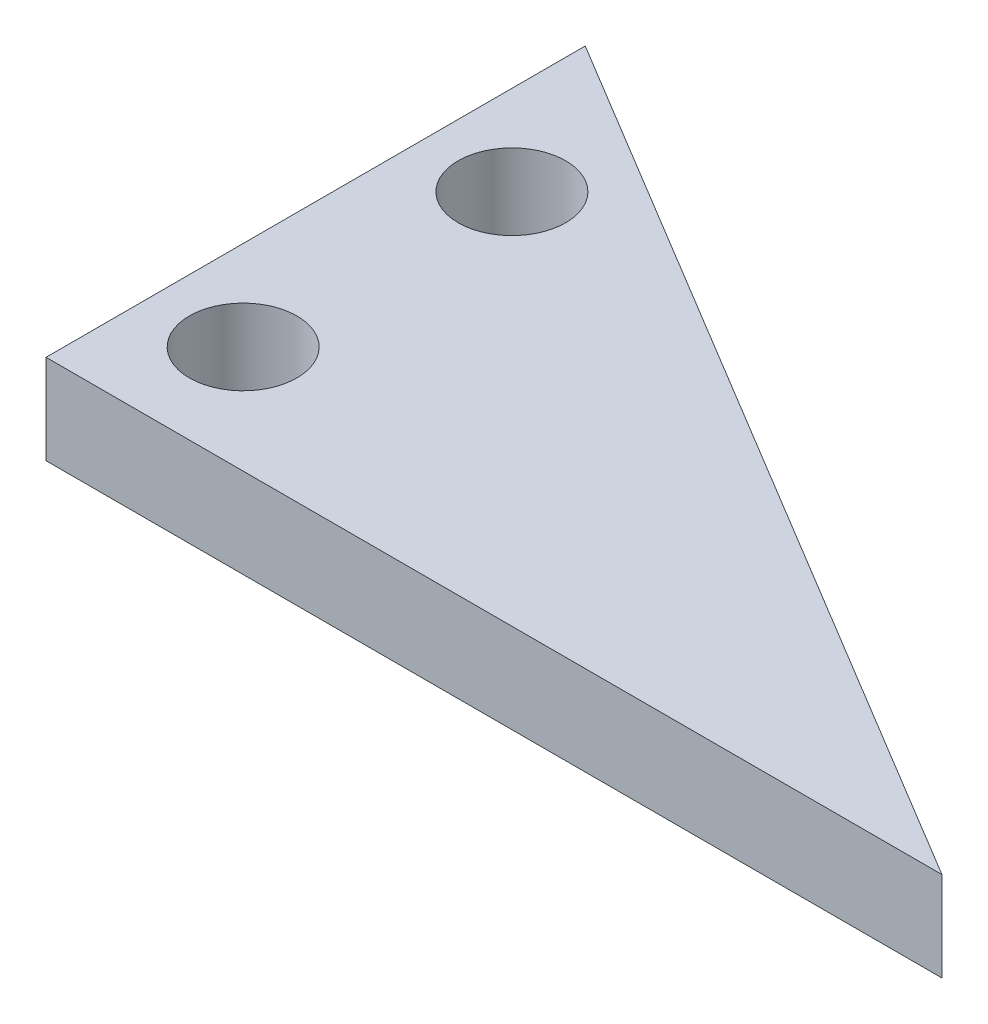
ISO-10303-21;
HEADER;
FILE_DESCRIPTION(('STEP AP214'),'2;1');
FILE_NAME('part.step','',(''),(''),'','','');
FILE_SCHEMA(('AUTOMOTIVE_DESIGN { 1 0 10303 214 1 1 1 1 }'));
ENDSEC;
DATA;
#1=APPLICATION_CONTEXT('core data for automotive mechanical design processes');
#2=APPLICATION_PROTOCOL_DEFINITION('international standard','automotive_design',2000,#1);
#3=PRODUCT_CONTEXT('',#1,'mechanical');
#4=PRODUCT('Part','Part','',(#3));
#5=PRODUCT_RELATED_PRODUCT_CATEGORY('part','',(#4));
#6=PRODUCT_DEFINITION_FORMATION('','',#4);
#7=PRODUCT_DEFINITION_CONTEXT('part definition',#1,'design');
#8=PRODUCT_DEFINITION('design','',#6,#7);
#9=PRODUCT_DEFINITION_SHAPE('','',#8);
#10=(LENGTH_UNIT() NAMED_UNIT(*) SI_UNIT(.MILLI.,.METRE.));
#11=(NAMED_UNIT(*) PLANE_ANGLE_UNIT() SI_UNIT($,.RADIAN.));
#12=(NAMED_UNIT(*) SI_UNIT($,.STERADIAN.) SOLID_ANGLE_UNIT());
#13=UNCERTAINTY_MEASURE_WITH_UNIT(LENGTH_MEASURE(1.E-05),#10,'distance_accuracy_value','');
#14=(GEOMETRIC_REPRESENTATION_CONTEXT(3) GLOBAL_UNCERTAINTY_ASSIGNED_CONTEXT((#13)) GLOBAL_UNIT_ASSIGNED_CONTEXT((#10,
#11,#12)) REPRESENTATION_CONTEXT('',''));
#15=CARTESIAN_POINT('',(0.,0.,0.));
#16=DIRECTION('',(0.,0.,1.));
#17=DIRECTION('',(1.,0.,0.));
#18=AXIS2_PLACEMENT_3D('',#15,#16,#17);
#19=CARTESIAN_POINT('',(0.,2.54,0.));
#20=DIRECTION('',(0.,-1.,0.));
#21=DIRECTION('',(0.,0.,-1.));
#22=AXIS2_PLACEMENT_3D('',#19,#20,#21);
#23=PLANE('',#22);
#24=DIRECTION('',(0.,0.,1.));
#25=VECTOR('',#24,1.);
#26=CARTESIAN_POINT('',(0.,2.54,0.));
#27=LINE('',#26,#25);
#28=CARTESIAN_POINT('',(0.,2.54,-15.2859179784456));
#29=VERTEX_POINT('',#28);
#30=CARTESIAN_POINT('',(0.,2.54,0.));
#31=VERTEX_POINT('',#30);
#32=EDGE_CURVE('E78',#29,#31,#27,.T.);
#33=ORIENTED_EDGE('',*,*,#32,.T.);
#34=DIRECTION('',(1.,0.,0.));
#35=VECTOR('',#34,1.);
#36=CARTESIAN_POINT('',(0.,2.54,0.));
#37=LINE('',#36,#35);
#38=CARTESIAN_POINT('',(25.4,2.54,0.));
#39=VERTEX_POINT('',#38);
#40=EDGE_CURVE('E77',#31,#39,#37,.T.);
#41=ORIENTED_EDGE('',*,*,#40,.T.);
#42=DIRECTION('',(-0.85680881602922,0.,-0.515634223820148));
#43=VECTOR('',#42,1.);
#44=CARTESIAN_POINT('',(0.,2.54,-15.2859179784456));
#45=LINE('',#44,#43);
#46=EDGE_CURVE('E57',#39,#29,#45,.T.);
#47=ORIENTED_EDGE('',*,*,#46,.T.);
#48=EDGE_LOOP('',(#33,#41,#47));
#49=FACE_BOUND('',#48,.T.);
#50=CARTESIAN_POINT('',(2.54,2.54,-3.048));
#51=DIRECTION('',(0.,1.,0.));
#52=DIRECTION('',(0.,0.,1.));
#53=AXIS2_PLACEMENT_3D('',#50,#51,#52);
#54=CIRCLE('',#53,1.524);
#55=CARTESIAN_POINT('',(2.54,2.54,-1.524));
#56=VERTEX_POINT('',#55);
#57=EDGE_CURVE('E89',#56,#56,#54,.T.);
#58=ORIENTED_EDGE('',*,*,#57,.F.);
#59=EDGE_LOOP('',(#58));
#60=FACE_BOUND('',#59,.T.);
#61=CARTESIAN_POINT('',(2.54,2.54,-10.668));
#62=DIRECTION('',(0.,1.,0.));
#63=DIRECTION('',(0.,0.,1.));
#64=AXIS2_PLACEMENT_3D('',#61,#62,#63);
#65=CIRCLE('',#64,1.524);
#66=CARTESIAN_POINT('',(2.54,2.54,-9.144));
#67=VERTEX_POINT('',#66);
#68=EDGE_CURVE('E108',#67,#67,#65,.T.);
#69=ORIENTED_EDGE('',*,*,#68,.F.);
#70=EDGE_LOOP('',(#69));
#71=FACE_BOUND('',#70,.T.);
#72=ADVANCED_FACE('F39',(#49,#60,#71),#23,.F.);
#73=CARTESIAN_POINT('',(0.,0.,0.));
#74=DIRECTION('',(0.,-1.,0.));
#75=DIRECTION('',(0.,0.,-1.));
#76=AXIS2_PLACEMENT_3D('',#73,#74,#75);
#77=PLANE('',#76);
#78=CARTESIAN_POINT('',(2.54,0.,-3.048));
#79=DIRECTION('',(0.,1.,0.));
#80=DIRECTION('',(0.,0.,1.));
#81=AXIS2_PLACEMENT_3D('',#78,#79,#80);
#82=CIRCLE('',#81,1.524);
#83=CARTESIAN_POINT('',(2.54,0.,-1.524));
#84=VERTEX_POINT('',#83);
#85=EDGE_CURVE('E94',#84,#84,#82,.T.);
#86=ORIENTED_EDGE('',*,*,#85,.T.);
#87=EDGE_LOOP('',(#86));
#88=FACE_BOUND('',#87,.T.);
#89=DIRECTION('',(0.,0.,1.));
#90=VECTOR('',#89,1.);
#91=CARTESIAN_POINT('',(0.,0.,0.));
#92=LINE('',#91,#90);
#93=CARTESIAN_POINT('',(0.,0.,-15.2859179784456));
#94=VERTEX_POINT('',#93);
#95=CARTESIAN_POINT('',(0.,0.,0.));
#96=VERTEX_POINT('',#95);
#97=EDGE_CURVE('E87',#94,#96,#92,.T.);
#98=ORIENTED_EDGE('',*,*,#97,.F.);
#99=DIRECTION('',(-0.85680881602922,0.,-0.515634223820148));
#100=VECTOR('',#99,1.);
#101=CARTESIAN_POINT('',(0.,0.,-15.2859179784456));
#102=LINE('',#101,#100);
#103=CARTESIAN_POINT('',(25.4,0.,0.));
#104=VERTEX_POINT('',#103);
#105=EDGE_CURVE('E71',#104,#94,#102,.T.);
#106=ORIENTED_EDGE('',*,*,#105,.F.);
#107=DIRECTION('',(1.,0.,0.));
#108=VECTOR('',#107,1.);
#109=CARTESIAN_POINT('',(0.,0.,0.));
#110=LINE('',#109,#108);
#111=EDGE_CURVE('E68',#96,#104,#110,.T.);
#112=ORIENTED_EDGE('',*,*,#111,.F.);
#113=EDGE_LOOP('',(#98,#106,#112));
#114=FACE_BOUND('',#113,.T.);
#115=CARTESIAN_POINT('',(2.54,0.,-10.668));
#116=DIRECTION('',(0.,1.,0.));
#117=DIRECTION('',(0.,0.,1.));
#118=AXIS2_PLACEMENT_3D('',#115,#116,#117);
#119=CIRCLE('',#118,1.524);
#120=CARTESIAN_POINT('',(2.54,0.,-9.144));
#121=VERTEX_POINT('',#120);
#122=EDGE_CURVE('E110',#121,#121,#119,.T.);
#123=ORIENTED_EDGE('',*,*,#122,.T.);
#124=EDGE_LOOP('',(#123));
#125=FACE_BOUND('',#124,.T.);
#126=ADVANCED_FACE('F99',(#88,#114,#125),#77,.T.);
#127=CARTESIAN_POINT('',(0.,2.54,0.));
#128=DIRECTION('',(1.,0.,0.));
#129=DIRECTION('',(0.,0.,-1.));
#130=AXIS2_PLACEMENT_3D('',#127,#128,#129);
#131=PLANE('',#130);
#132=ORIENTED_EDGE('',*,*,#97,.T.);
#133=DIRECTION('',(0.,-1.,0.));
#134=VECTOR('',#133,1.);
#135=CARTESIAN_POINT('',(0.,2.54,0.));
#136=LINE('',#135,#134);
#137=EDGE_CURVE('E11',#31,#96,#136,.T.);
#138=ORIENTED_EDGE('',*,*,#137,.F.);
#139=ORIENTED_EDGE('',*,*,#32,.F.);
#140=DIRECTION('',(0.,-1.,0.));
#141=VECTOR('',#140,1.);
#142=CARTESIAN_POINT('',(0.,2.54,-15.2859179784456));
#143=LINE('',#142,#141);
#144=EDGE_CURVE('E86',#29,#94,#143,.T.);
#145=ORIENTED_EDGE('',*,*,#144,.T.);
#146=EDGE_LOOP('',(#132,#138,#139,#145));
#147=FACE_BOUND('',#146,.T.);
#148=ADVANCED_FACE('F41',(#147),#131,.F.);
#149=CARTESIAN_POINT('',(0.,2.54,0.));
#150=DIRECTION('',(0.,0.,-1.));
#151=DIRECTION('',(-1.,0.,0.));
#152=AXIS2_PLACEMENT_3D('',#149,#150,#151);
#153=PLANE('',#152);
#154=ORIENTED_EDGE('',*,*,#111,.T.);
#155=DIRECTION('',(0.,-1.,0.));
#156=VECTOR('',#155,1.);
#157=CARTESIAN_POINT('',(25.4,2.54,0.));
#158=LINE('',#157,#156);
#159=EDGE_CURVE('E48',#39,#104,#158,.T.);
#160=ORIENTED_EDGE('',*,*,#159,.F.);
#161=ORIENTED_EDGE('',*,*,#40,.F.);
#162=ORIENTED_EDGE('',*,*,#137,.T.);
#163=EDGE_LOOP('',(#154,#160,#161,#162));
#164=FACE_BOUND('',#163,.T.);
#165=ADVANCED_FACE('F80',(#164),#153,.F.);
#166=CARTESIAN_POINT('',(0.,2.54,-15.2859179784456));
#167=DIRECTION('',(-0.515634223820148,0.,0.85680881602922));
#168=DIRECTION('',(0.85680881602922,0.,0.515634223820148));
#169=AXIS2_PLACEMENT_3D('',#166,#167,#168);
#170=PLANE('',#169);
#171=ORIENTED_EDGE('',*,*,#105,.T.);
#172=ORIENTED_EDGE('',*,*,#144,.F.);
#173=ORIENTED_EDGE('',*,*,#46,.F.);
#174=ORIENTED_EDGE('',*,*,#159,.T.);
#175=EDGE_LOOP('',(#171,#172,#173,#174));
#176=FACE_BOUND('',#175,.T.);
#177=ADVANCED_FACE('F97',(#176),#170,.F.);
#178=CARTESIAN_POINT('',(2.54,2.54,-3.048));
#179=DIRECTION('',(0.,-1.,0.));
#180=DIRECTION('',(0.,0.,-1.));
#181=AXIS2_PLACEMENT_3D('',#178,#179,#180);
#182=CYLINDRICAL_SURFACE('',#181,1.524);
#183=ORIENTED_EDGE('',*,*,#57,.T.);
#184=EDGE_LOOP('',(#183));
#185=FACE_BOUND('',#184,.T.);
#186=ORIENTED_EDGE('',*,*,#85,.F.);
#187=EDGE_LOOP('',(#186));
#188=FACE_BOUND('',#187,.T.);
#189=ADVANCED_FACE('F120',(#185,#188),#182,.F.);
#190=CARTESIAN_POINT('',(2.54,2.54,-10.668));
#191=DIRECTION('',(0.,-1.,0.));
#192=DIRECTION('',(0.,0.,-1.));
#193=AXIS2_PLACEMENT_3D('',#190,#191,#192);
#194=CYLINDRICAL_SURFACE('',#193,1.524);
#195=ORIENTED_EDGE('',*,*,#68,.T.);
#196=EDGE_LOOP('',(#195));
#197=FACE_BOUND('',#196,.T.);
#198=ORIENTED_EDGE('',*,*,#122,.F.);
#199=EDGE_LOOP('',(#198));
#200=FACE_BOUND('',#199,.T.);
#201=ADVANCED_FACE('F116',(#197,#200),#194,.F.);
#202=CLOSED_SHELL('',(#72,#126,#148,#165,#177,#189,#201));
#203=MANIFOLD_SOLID_BREP('B2',#202);
#204=ADVANCED_BREP_SHAPE_REPRESENTATION('',(#18,#203),#14);
#205=SHAPE_DEFINITION_REPRESENTATION(#9,#204);
ENDSEC;
END-ISO-10303-21;
